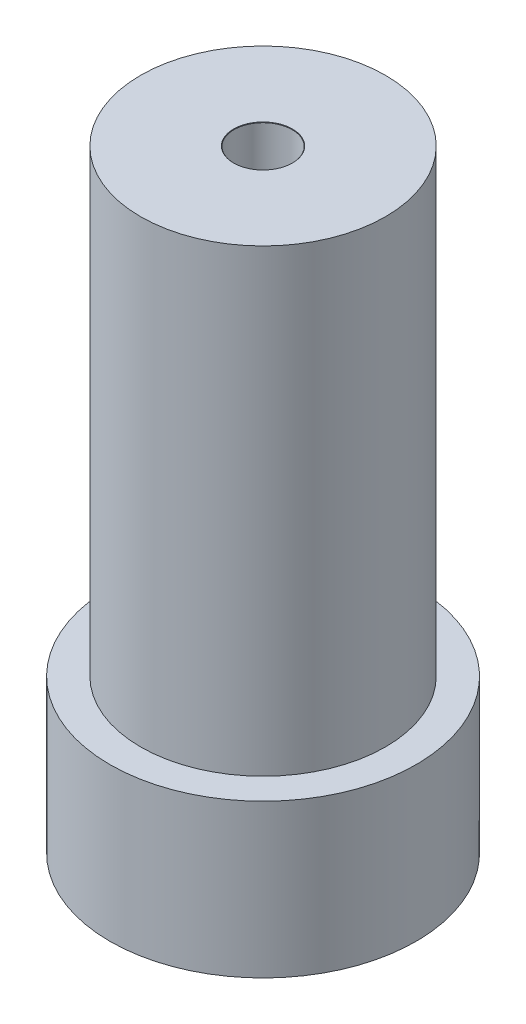
ISO-10303-21;
HEADER;
FILE_DESCRIPTION(('STEP AP214'),'2;1');
FILE_NAME('part.step','',(''),(''),'','','');
FILE_SCHEMA(('AUTOMOTIVE_DESIGN { 1 0 10303 214 1 1 1 1 }'));
ENDSEC;
DATA;
#1=APPLICATION_CONTEXT('core data for automotive mechanical design processes');
#2=APPLICATION_PROTOCOL_DEFINITION('international standard','automotive_design',2000,#1);
#3=PRODUCT_CONTEXT('',#1,'mechanical');
#4=PRODUCT('Part','Part','',(#3));
#5=PRODUCT_RELATED_PRODUCT_CATEGORY('part','',(#4));
#6=PRODUCT_DEFINITION_FORMATION('','',#4);
#7=PRODUCT_DEFINITION_CONTEXT('part definition',#1,'design');
#8=PRODUCT_DEFINITION('design','',#6,#7);
#9=PRODUCT_DEFINITION_SHAPE('','',#8);
#10=(LENGTH_UNIT() NAMED_UNIT(*) SI_UNIT(.MILLI.,.METRE.));
#11=(NAMED_UNIT(*) PLANE_ANGLE_UNIT() SI_UNIT($,.RADIAN.));
#12=(NAMED_UNIT(*) SI_UNIT($,.STERADIAN.) SOLID_ANGLE_UNIT());
#13=UNCERTAINTY_MEASURE_WITH_UNIT(LENGTH_MEASURE(1.E-05),#10,'distance_accuracy_value','');
#14=(GEOMETRIC_REPRESENTATION_CONTEXT(3) GLOBAL_UNCERTAINTY_ASSIGNED_CONTEXT((#13)) GLOBAL_UNIT_ASSIGNED_CONTEXT((#10,
#11,#12)) REPRESENTATION_CONTEXT('',''));
#15=CARTESIAN_POINT('',(0.,0.,0.));
#16=DIRECTION('',(0.,0.,1.));
#17=DIRECTION('',(1.,0.,0.));
#18=AXIS2_PLACEMENT_3D('',#15,#16,#17);
#19=CARTESIAN_POINT('',(0.,40.,0.));
#20=DIRECTION('',(0.,1.,0.));
#21=DIRECTION('',(0.,0.,1.));
#22=AXIS2_PLACEMENT_3D('',#19,#20,#21);
#23=PLANE('',#22);
#24=CARTESIAN_POINT('',(0.,40.,0.));
#25=DIRECTION('',(0.,1.,0.));
#26=DIRECTION('',(0.,0.,1.));
#27=AXIS2_PLACEMENT_3D('',#24,#25,#26);
#28=CIRCLE('',#27,1.925);
#29=CARTESIAN_POINT('',(0.,40.,1.925));
#30=VERTEX_POINT('',#29);
#31=EDGE_CURVE('E54',#30,#30,#28,.T.);
#32=ORIENTED_EDGE('',*,*,#31,.F.);
#33=EDGE_LOOP('',(#32));
#34=FACE_BOUND('',#33,.T.);
#35=CARTESIAN_POINT('',(0.,40.,0.));
#36=DIRECTION('',(0.,1.,0.));
#37=DIRECTION('',(0.,0.,1.));
#38=AXIS2_PLACEMENT_3D('',#35,#36,#37);
#39=CIRCLE('',#38,8.);
#40=CARTESIAN_POINT('',(0.,40.,8.));
#41=VERTEX_POINT('',#40);
#42=EDGE_CURVE('E59',#41,#41,#39,.T.);
#43=ORIENTED_EDGE('',*,*,#42,.T.);
#44=EDGE_LOOP('',(#43));
#45=FACE_BOUND('',#44,.T.);
#46=ADVANCED_FACE('F32',(#34,#45),#23,.T.);
#47=CARTESIAN_POINT('',(0.,25.,0.));
#48=DIRECTION('',(0.,1.,0.));
#49=DIRECTION('',(0.,0.,1.));
#50=AXIS2_PLACEMENT_3D('',#47,#48,#49);
#51=CONICAL_SURFACE('',#50,1.9,1.02974425867665);
#52=CARTESIAN_POINT('',(0.,23.8583648238476,0.));
#53=VERTEX_POINT('',#52);
#54=VERTEX_LOOP('',#53);
#55=FACE_BOUND('',#54,.T.);
#56=CARTESIAN_POINT('',(0.,25.,0.));
#57=DIRECTION('',(0.,1.,0.));
#58=DIRECTION('',(0.,0.,1.));
#59=AXIS2_PLACEMENT_3D('',#56,#57,#58);
#60=CIRCLE('',#59,1.9);
#61=CARTESIAN_POINT('',(0.,25.,1.9));
#62=VERTEX_POINT('',#61);
#63=EDGE_CURVE('E40',#62,#62,#60,.T.);
#64=ORIENTED_EDGE('',*,*,#63,.T.);
#65=EDGE_LOOP('',(#64));
#66=FACE_BOUND('',#65,.T.);
#67=ADVANCED_FACE('F43',(#55,#66),#51,.F.);
#68=CARTESIAN_POINT('',(0.,40.,0.));
#69=DIRECTION('',(0.,1.,0.));
#70=DIRECTION('',(0.,0.,1.));
#71=AXIS2_PLACEMENT_3D('',#68,#69,#70);
#72=CYLINDRICAL_SURFACE('',#71,1.9);
#73=ORIENTED_EDGE('',*,*,#63,.F.);
#74=EDGE_LOOP('',(#73));
#75=FACE_BOUND('',#74,.T.);
#76=CARTESIAN_POINT('',(0.,39.975,0.));
#77=DIRECTION('',(0.,1.,0.));
#78=DIRECTION('',(0.,0.,1.));
#79=AXIS2_PLACEMENT_3D('',#76,#77,#78);
#80=CIRCLE('',#79,1.9);
#81=CARTESIAN_POINT('',(0.,39.975,1.9));
#82=VERTEX_POINT('',#81);
#83=EDGE_CURVE('E51',#82,#82,#80,.T.);
#84=ORIENTED_EDGE('',*,*,#83,.T.);
#85=EDGE_LOOP('',(#84));
#86=FACE_BOUND('',#85,.T.);
#87=ADVANCED_FACE('F46',(#75,#86),#72,.F.);
#88=CARTESIAN_POINT('',(0.,40.,0.));
#89=DIRECTION('',(0.,1.,0.));
#90=DIRECTION('',(0.,0.,1.));
#91=AXIS2_PLACEMENT_3D('',#88,#89,#90);
#92=CONICAL_SURFACE('',#91,1.925,0.785398163397505);
#93=ORIENTED_EDGE('',*,*,#83,.F.);
#94=EDGE_LOOP('',(#93));
#95=FACE_BOUND('',#94,.T.);
#96=ORIENTED_EDGE('',*,*,#31,.T.);
#97=EDGE_LOOP('',(#96));
#98=FACE_BOUND('',#97,.T.);
#99=ADVANCED_FACE('F89',(#95,#98),#92,.F.);
#100=CARTESIAN_POINT('',(0.,10.,0.));
#101=DIRECTION('',(0.,1.,0.));
#102=DIRECTION('',(0.,0.,1.));
#103=AXIS2_PLACEMENT_3D('',#100,#101,#102);
#104=PLANE('',#103);
#105=CARTESIAN_POINT('',(0.,10.,0.));
#106=DIRECTION('',(0.,1.,0.));
#107=DIRECTION('',(0.,0.,1.));
#108=AXIS2_PLACEMENT_3D('',#105,#106,#107);
#109=CIRCLE('',#108,8.);
#110=CARTESIAN_POINT('',(0.,10.,8.));
#111=VERTEX_POINT('',#110);
#112=EDGE_CURVE('E62',#111,#111,#109,.T.);
#113=ORIENTED_EDGE('',*,*,#112,.F.);
#114=EDGE_LOOP('',(#113));
#115=FACE_BOUND('',#114,.T.);
#116=CARTESIAN_POINT('',(0.,10.,0.));
#117=DIRECTION('',(0.,1.,0.));
#118=DIRECTION('',(0.,0.,1.));
#119=AXIS2_PLACEMENT_3D('',#116,#117,#118);
#120=CIRCLE('',#119,10.);
#121=CARTESIAN_POINT('',(0.,10.,10.));
#122=VERTEX_POINT('',#121);
#123=EDGE_CURVE('E36',#122,#122,#120,.T.);
#124=ORIENTED_EDGE('',*,*,#123,.T.);
#125=EDGE_LOOP('',(#124));
#126=FACE_BOUND('',#125,.T.);
#127=ADVANCED_FACE('F69',(#115,#126),#104,.T.);
#128=CARTESIAN_POINT('',(0.,10.,0.));
#129=DIRECTION('',(0.,1.,0.));
#130=DIRECTION('',(0.,0.,1.));
#131=AXIS2_PLACEMENT_3D('',#128,#129,#130);
#132=CYLINDRICAL_SURFACE('',#131,8.);
#133=ORIENTED_EDGE('',*,*,#112,.T.);
#134=EDGE_LOOP('',(#133));
#135=FACE_BOUND('',#134,.T.);
#136=ORIENTED_EDGE('',*,*,#42,.F.);
#137=EDGE_LOOP('',(#136));
#138=FACE_BOUND('',#137,.T.);
#139=ADVANCED_FACE('F77',(#135,#138),#132,.T.);
#140=CARTESIAN_POINT('',(0.,0.,0.));
#141=DIRECTION('',(0.,1.,0.));
#142=DIRECTION('',(0.,0.,1.));
#143=AXIS2_PLACEMENT_3D('',#140,#141,#142);
#144=PLANE('',#143);
#145=CARTESIAN_POINT('',(0.,0.,0.));
#146=DIRECTION('',(0.,1.,0.));
#147=DIRECTION('',(0.,0.,1.));
#148=AXIS2_PLACEMENT_3D('',#145,#146,#147);
#149=CIRCLE('',#148,10.);
#150=CARTESIAN_POINT('',(0.,0.,10.));
#151=VERTEX_POINT('',#150);
#152=EDGE_CURVE('E11',#151,#151,#149,.T.);
#153=ORIENTED_EDGE('',*,*,#152,.F.);
#154=EDGE_LOOP('',(#153));
#155=FACE_BOUND('',#154,.T.);
#156=ADVANCED_FACE('F72',(#155),#144,.F.);
#157=CARTESIAN_POINT('',(0.,40.,0.));
#158=DIRECTION('',(0.,-1.,0.));
#159=DIRECTION('',(0.,0.,-1.));
#160=AXIS2_PLACEMENT_3D('',#157,#158,#159);
#161=CYLINDRICAL_SURFACE('',#160,10.);
#162=ORIENTED_EDGE('',*,*,#152,.T.);
#163=EDGE_LOOP('',(#162));
#164=FACE_BOUND('',#163,.T.);
#165=ORIENTED_EDGE('',*,*,#123,.F.);
#166=EDGE_LOOP('',(#165));
#167=FACE_BOUND('',#166,.T.);
#168=ADVANCED_FACE('F34',(#164,#167),#161,.T.);
#169=CLOSED_SHELL('',(#46,#67,#87,#99,#127,#139,#156,#168));
#170=MANIFOLD_SOLID_BREP('B2',#169);
#171=ADVANCED_BREP_SHAPE_REPRESENTATION('',(#18,#170),#14);
#172=SHAPE_DEFINITION_REPRESENTATION(#9,#171);
ENDSEC;
END-ISO-10303-21;
